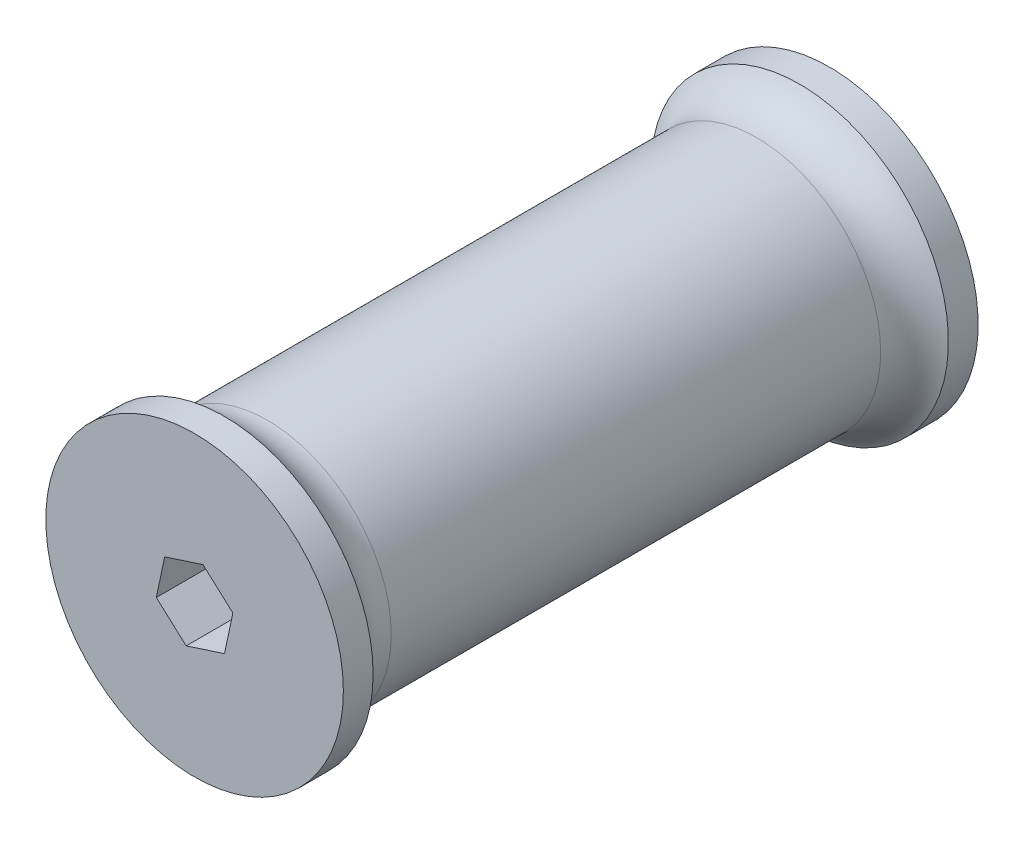
ISO-10303-21;
HEADER;
FILE_DESCRIPTION(('STEP AP214'),'2;1');
FILE_NAME('part.step','',(''),(''),'','','');
FILE_SCHEMA(('AUTOMOTIVE_DESIGN { 1 0 10303 214 1 1 1 1 }'));
ENDSEC;
DATA;
#1=APPLICATION_CONTEXT('core data for automotive mechanical design processes');
#2=APPLICATION_PROTOCOL_DEFINITION('international standard','automotive_design',2000,#1);
#3=PRODUCT_CONTEXT('',#1,'mechanical');
#4=PRODUCT('Part','Part','',(#3));
#5=PRODUCT_RELATED_PRODUCT_CATEGORY('part','',(#4));
#6=PRODUCT_DEFINITION_FORMATION('','',#4);
#7=PRODUCT_DEFINITION_CONTEXT('part definition',#1,'design');
#8=PRODUCT_DEFINITION('design','',#6,#7);
#9=PRODUCT_DEFINITION_SHAPE('','',#8);
#10=(LENGTH_UNIT() NAMED_UNIT(*) SI_UNIT(.MILLI.,.METRE.));
#11=(NAMED_UNIT(*) PLANE_ANGLE_UNIT() SI_UNIT($,.RADIAN.));
#12=(NAMED_UNIT(*) SI_UNIT($,.STERADIAN.) SOLID_ANGLE_UNIT());
#13=UNCERTAINTY_MEASURE_WITH_UNIT(LENGTH_MEASURE(1.E-05),#10,'distance_accuracy_value','');
#14=(GEOMETRIC_REPRESENTATION_CONTEXT(3) GLOBAL_UNCERTAINTY_ASSIGNED_CONTEXT((#13)) GLOBAL_UNIT_ASSIGNED_CONTEXT((#10,
#11,#12)) REPRESENTATION_CONTEXT('',''));
#15=CARTESIAN_POINT('',(0.,0.,0.));
#16=DIRECTION('',(0.,0.,1.));
#17=DIRECTION('',(1.,0.,0.));
#18=AXIS2_PLACEMENT_3D('',#15,#16,#17);
#19=CARTESIAN_POINT('',(0.,0.,-61.));
#20=DIRECTION('',(0.,0.,1.));
#21=DIRECTION('',(1.,0.,0.));
#22=AXIS2_PLACEMENT_3D('',#19,#20,#21);
#23=CYLINDRICAL_SURFACE('',#22,15.);
#24=CARTESIAN_POINT('',(0.,0.,-61.));
#25=DIRECTION('',(0.,0.,-1.));
#26=DIRECTION('',(-1.,0.,0.));
#27=AXIS2_PLACEMENT_3D('',#24,#25,#26);
#28=CIRCLE('',#27,15.);
#29=CARTESIAN_POINT('',(-15.,0.,-61.));
#30=VERTEX_POINT('',#29);
#31=EDGE_CURVE('E167',#30,#30,#28,.T.);
#32=ORIENTED_EDGE('',*,*,#31,.F.);
#33=EDGE_LOOP('',(#32));
#34=FACE_BOUND('',#33,.T.);
#35=CARTESIAN_POINT('',(0.,0.,-58.));
#36=DIRECTION('',(0.,0.,-1.));
#37=DIRECTION('',(-1.,0.,0.));
#38=AXIS2_PLACEMENT_3D('',#35,#36,#37);
#39=CIRCLE('',#38,15.);
#40=CARTESIAN_POINT('',(-15.,0.,-58.));
#41=VERTEX_POINT('',#40);
#42=EDGE_CURVE('E165',#41,#41,#39,.T.);
#43=ORIENTED_EDGE('',*,*,#42,.T.);
#44=EDGE_LOOP('',(#43));
#45=FACE_BOUND('',#44,.T.);
#46=ADVANCED_FACE('F33',(#34,#45),#23,.T.);
#47=CARTESIAN_POINT('',(0.,0.,-61.));
#48=DIRECTION('',(0.,0.,-1.));
#49=DIRECTION('',(-1.,0.,0.));
#50=AXIS2_PLACEMENT_3D('',#47,#48,#49);
#51=PLANE('',#50);
#52=CARTESIAN_POINT('',(0.,0.,-61.));
#53=DIRECTION('',(0.,0.,-1.));
#54=DIRECTION('',(-1.,0.,0.));
#55=AXIS2_PLACEMENT_3D('',#52,#53,#54);
#56=CIRCLE('',#55,2.05);
#57=CARTESIAN_POINT('',(0.160815888999146,2.043682521784,-61.));
#58=VERTEX_POINT('',#57);
#59=CARTESIAN_POINT('',(-2.04562172688168,0.133909486256969,-61.));
#60=VERTEX_POINT('',#59);
#61=EDGE_CURVE('E56',#58,#60,#56,.T.);
#62=ORIENTED_EDGE('',*,*,#61,.F.);
#63=DIRECTION('',(0.756108336125337,0.654446471486992,0.));
#64=VECTOR('',#63,1.);
#65=CARTESIAN_POINT('',(-2.04562172688168,0.133909486256968,-61.));
#66=LINE('',#65,#64);
#67=EDGE_CURVE('E156',#60,#58,#66,.T.);
#68=ORIENTED_EDGE('',*,*,#67,.F.);
#69=EDGE_LOOP('',(#62,#68));
#70=FACE_BOUND('',#69,.T.);
#71=ORIENTED_EDGE('',*,*,#31,.T.);
#72=EDGE_LOOP('',(#71));
#73=FACE_BOUND('',#72,.T.);
#74=ADVANCED_FACE('F195',(#70,#73),#51,.T.);
#75=CARTESIAN_POINT('',(0.,0.,-53.));
#76=DIRECTION('',(0.,0.,-1.));
#77=DIRECTION('',(-1.,0.,0.));
#78=AXIS2_PLACEMENT_3D('',#75,#76,#77);
#79=CYLINDRICAL_SURFACE('',#78,2.05);
#80=ORIENTED_EDGE('',*,*,#61,.T.);
#81=DIRECTION('',(0.,0.,-1.));
#82=VECTOR('',#81,1.);
#83=CARTESIAN_POINT('',(-2.04562172688168,0.133909486256968,-53.));
#84=LINE('',#83,#82);
#85=CARTESIAN_POINT('',(-2.04562172688168,0.133909486256968,-53.));
#86=VERTEX_POINT('',#85);
#87=EDGE_CURVE('E159',#86,#60,#84,.T.);
#88=ORIENTED_EDGE('',*,*,#87,.F.);
#89=CARTESIAN_POINT('',(0.,0.,-53.));
#90=DIRECTION('',(0.,0.,-1.));
#91=DIRECTION('',(-1.,0.,0.));
#92=AXIS2_PLACEMENT_3D('',#89,#90,#91);
#93=CIRCLE('',#92,2.05);
#94=CARTESIAN_POINT('',(0.160815888999146,2.043682521784,-53.));
#95=VERTEX_POINT('',#94);
#96=EDGE_CURVE('E152',#95,#86,#93,.T.);
#97=ORIENTED_EDGE('',*,*,#96,.F.);
#98=DIRECTION('',(0.,0.,-1.));
#99=VECTOR('',#98,1.);
#100=CARTESIAN_POINT('',(0.160815888999146,2.043682521784,-53.));
#101=LINE('',#100,#99);
#102=EDGE_CURVE('E163',#95,#58,#101,.T.);
#103=ORIENTED_EDGE('',*,*,#102,.T.);
#104=EDGE_LOOP('',(#80,#88,#97,#103));
#105=FACE_BOUND('',#104,.T.);
#106=ADVANCED_FACE('F201',(#105),#79,.F.);
#107=CARTESIAN_POINT('',(-2.04562172688168,0.133909486256968,-53.));
#108=DIRECTION('',(-0.654446471486992,0.756108336125337,0.));
#109=DIRECTION('',(-0.756108336125337,-0.654446471486992,0.));
#110=AXIS2_PLACEMENT_3D('',#107,#108,#109);
#111=PLANE('',#110);
#112=ORIENTED_EDGE('',*,*,#67,.T.);
#113=ORIENTED_EDGE('',*,*,#102,.F.);
#114=DIRECTION('',(0.756108336125337,0.654446471486992,0.));
#115=VECTOR('',#114,1.);
#116=CARTESIAN_POINT('',(-2.04562172688168,0.133909486256968,-53.));
#117=LINE('',#116,#115);
#118=EDGE_CURVE('E155',#86,#95,#117,.T.);
#119=ORIENTED_EDGE('',*,*,#118,.F.);
#120=ORIENTED_EDGE('',*,*,#87,.T.);
#121=EDGE_LOOP('',(#112,#113,#119,#120));
#122=FACE_BOUND('',#121,.T.);
#123=ADVANCED_FACE('F310',(#122),#111,.F.);
#124=CARTESIAN_POINT('',(0.,0.,-53.));
#125=DIRECTION('',(0.,0.,-1.));
#126=DIRECTION('',(-1.,0.,0.));
#127=AXIS2_PLACEMENT_3D('',#124,#125,#126);
#128=PLANE('',#127);
#129=ORIENTED_EDGE('',*,*,#96,.T.);
#130=ORIENTED_EDGE('',*,*,#118,.T.);
#131=EDGE_LOOP('',(#129,#130));
#132=FACE_BOUND('',#131,.T.);
#133=ADVANCED_FACE('F306',(#132),#128,.T.);
#134=CARTESIAN_POINT('',(0.,0.,-93.3553390593274));
#135=DIRECTION('',(0.,0.,1.));
#136=DIRECTION('',(1.,0.,0.));
#137=AXIS2_PLACEMENT_3D('',#134,#135,#136);
#138=CYLINDRICAL_SURFACE('',#137,12.5);
#139=CARTESIAN_POINT('',(0.,0.,-53.6698729810778));
#140=DIRECTION('',(0.,0.,-1.));
#141=DIRECTION('',(-1.,0.,0.));
#142=AXIS2_PLACEMENT_3D('',#139,#140,#141);
#143=CIRCLE('',#142,12.5);
#144=CARTESIAN_POINT('',(-12.5,0.,-53.6698729810778));
#145=VERTEX_POINT('',#144);
#146=EDGE_CURVE('E11',#145,#145,#143,.F.);
#147=ORIENTED_EDGE('',*,*,#146,.T.);
#148=EDGE_LOOP('',(#147));
#149=FACE_BOUND('',#148,.T.);
#150=CARTESIAN_POINT('',(0.,0.,-4.33012701892219));
#151=DIRECTION('',(0.,0.,1.));
#152=DIRECTION('',(1.,0.,0.));
#153=AXIS2_PLACEMENT_3D('',#150,#151,#152);
#154=CIRCLE('',#153,12.5);
#155=CARTESIAN_POINT('',(12.5,0.,-4.33012701892219));
#156=VERTEX_POINT('',#155);
#157=EDGE_CURVE('E41',#156,#156,#154,.F.);
#158=ORIENTED_EDGE('',*,*,#157,.T.);
#159=EDGE_LOOP('',(#158));
#160=FACE_BOUND('',#159,.T.);
#161=ADVANCED_FACE('F180',(#149,#160),#138,.T.);
#162=CARTESIAN_POINT('',(0.,0.,3.));
#163=DIRECTION('',(0.,0.,1.));
#164=DIRECTION('',(1.,0.,0.));
#165=AXIS2_PLACEMENT_3D('',#162,#163,#164);
#166=PLANE('',#165);
#167=DIRECTION('',(0.951315082902259,0.308220072420127,0.));
#168=VECTOR('',#167,1.);
#169=CARTESIAN_POINT('',(-0.847192142923414,-3.96937007676308,3.));
#170=LINE('',#169,#168);
#171=CARTESIAN_POINT('',(-0.847192142923414,-3.96937007676308,3.));
#172=VERTEX_POINT('',#171);
#173=CARTESIAN_POINT('',(3.01397925203691,-2.7183749560398,3.));
#174=VERTEX_POINT('',#173);
#175=EDGE_CURVE('E48',#172,#174,#170,.T.);
#176=ORIENTED_EDGE('',*,*,#175,.F.);
#177=DIRECTION('',(0.742583954123239,-0.669752992586592,0.));
#178=VECTOR('',#177,1.);
#179=CARTESIAN_POINT('',(-3.86117139496032,-1.25099512072329,3.));
#180=LINE('',#179,#178);
#181=CARTESIAN_POINT('',(-3.86117139496032,-1.25099512072329,3.));
#182=VERTEX_POINT('',#181);
#183=EDGE_CURVE('E119',#182,#172,#180,.T.);
#184=ORIENTED_EDGE('',*,*,#183,.F.);
#185=DIRECTION('',(-0.20873112877902,-0.977973065006719,0.));
#186=VECTOR('',#185,1.);
#187=CARTESIAN_POINT('',(-3.01397925203691,2.7183749560398,3.));
#188=LINE('',#187,#186);
#189=CARTESIAN_POINT('',(-3.01397925203691,2.7183749560398,3.));
#190=VERTEX_POINT('',#189);
#191=EDGE_CURVE('E122',#190,#182,#188,.T.);
#192=ORIENTED_EDGE('',*,*,#191,.F.);
#193=DIRECTION('',(-0.951315082902259,-0.308220072420127,0.));
#194=VECTOR('',#193,1.);
#195=CARTESIAN_POINT('',(0.847192142923415,3.96937007676308,3.));
#196=LINE('',#195,#194);
#197=CARTESIAN_POINT('',(0.847192142923415,3.96937007676308,3.));
#198=VERTEX_POINT('',#197);
#199=EDGE_CURVE('E138',#198,#190,#196,.T.);
#200=ORIENTED_EDGE('',*,*,#199,.F.);
#201=DIRECTION('',(-0.742583954123239,0.669752992586592,0.));
#202=VECTOR('',#201,1.);
#203=CARTESIAN_POINT('',(3.86117139496033,1.25099512072329,3.));
#204=LINE('',#203,#202);
#205=CARTESIAN_POINT('',(3.86117139496033,1.25099512072329,3.));
#206=VERTEX_POINT('',#205);
#207=EDGE_CURVE('E135',#206,#198,#204,.T.);
#208=ORIENTED_EDGE('',*,*,#207,.F.);
#209=DIRECTION('',(0.208731128779019,0.977973065006719,0.));
#210=VECTOR('',#209,1.);
#211=CARTESIAN_POINT('',(3.01397925203691,-2.7183749560398,3.));
#212=LINE('',#211,#210);
#213=EDGE_CURVE('E133',#174,#206,#212,.T.);
#214=ORIENTED_EDGE('',*,*,#213,.F.);
#215=EDGE_LOOP('',(#176,#184,#192,#200,#208,#214));
#216=FACE_BOUND('',#215,.T.);
#217=CARTESIAN_POINT('',(0.,0.,3.));
#218=DIRECTION('',(0.,0.,1.));
#219=DIRECTION('',(1.,0.,0.));
#220=AXIS2_PLACEMENT_3D('',#217,#218,#219);
#221=CIRCLE('',#220,15.);
#222=CARTESIAN_POINT('',(15.,0.,3.));
#223=VERTEX_POINT('',#222);
#224=EDGE_CURVE('E173',#223,#223,#221,.T.);
#225=ORIENTED_EDGE('',*,*,#224,.T.);
#226=EDGE_LOOP('',(#225));
#227=FACE_BOUND('',#226,.T.);
#228=ADVANCED_FACE('F208',(#216,#227),#166,.T.);
#229=CARTESIAN_POINT('',(0.,0.,3.));
#230=DIRECTION('',(0.,0.,-1.));
#231=DIRECTION('',(-1.,0.,0.));
#232=AXIS2_PLACEMENT_3D('',#229,#230,#231);
#233=CYLINDRICAL_SURFACE('',#232,15.);
#234=ORIENTED_EDGE('',*,*,#224,.F.);
#235=EDGE_LOOP('',(#234));
#236=FACE_BOUND('',#235,.T.);
#237=CARTESIAN_POINT('',(0.,0.,0.));
#238=DIRECTION('',(0.,0.,1.));
#239=DIRECTION('',(1.,0.,0.));
#240=AXIS2_PLACEMENT_3D('',#237,#238,#239);
#241=CIRCLE('',#240,15.);
#242=CARTESIAN_POINT('',(15.,0.,0.));
#243=VERTEX_POINT('',#242);
#244=EDGE_CURVE('E170',#243,#243,#241,.T.);
#245=ORIENTED_EDGE('',*,*,#244,.T.);
#246=EDGE_LOOP('',(#245));
#247=FACE_BOUND('',#246,.T.);
#248=ADVANCED_FACE('F191',(#236,#247),#233,.T.);
#249=CARTESIAN_POINT('',(0.,0.,-53.6698729810778));
#250=DIRECTION('',(0.,0.,-1.));
#251=DIRECTION('',(-1.,0.,0.));
#252=AXIS2_PLACEMENT_3D('',#249,#250,#251);
#253=TOROIDAL_SURFACE('',#252,17.5,5.);
#254=ORIENTED_EDGE('',*,*,#42,.F.);
#255=EDGE_LOOP('',(#254));
#256=FACE_BOUND('',#255,.T.);
#257=ORIENTED_EDGE('',*,*,#146,.F.);
#258=EDGE_LOOP('',(#257));
#259=FACE_BOUND('',#258,.T.);
#260=ADVANCED_FACE('F183',(#256,#259),#253,.F.);
#261=CARTESIAN_POINT('',(0.,0.,-4.33012701892219));
#262=DIRECTION('',(0.,0.,1.));
#263=DIRECTION('',(1.,0.,0.));
#264=AXIS2_PLACEMENT_3D('',#261,#262,#263);
#265=TOROIDAL_SURFACE('',#264,17.5,5.);
#266=ORIENTED_EDGE('',*,*,#244,.F.);
#267=EDGE_LOOP('',(#266));
#268=FACE_BOUND('',#267,.T.);
#269=ORIENTED_EDGE('',*,*,#157,.F.);
#270=EDGE_LOOP('',(#269));
#271=FACE_BOUND('',#270,.T.);
#272=ADVANCED_FACE('F35',(#268,#271),#265,.F.);
#273=CARTESIAN_POINT('',(-0.847192142923414,-3.96937007676308,-37.));
#274=DIRECTION('',(0.308220072420127,-0.951315082902259,0.));
#275=DIRECTION('',(0.951315082902259,0.308220072420127,0.));
#276=AXIS2_PLACEMENT_3D('',#273,#274,#275);
#277=PLANE('',#276);
#278=ORIENTED_EDGE('',*,*,#175,.T.);
#279=DIRECTION('',(0.,0.,1.));
#280=VECTOR('',#279,1.);
#281=CARTESIAN_POINT('',(3.01397925203691,-2.7183749560398,-37.));
#282=LINE('',#281,#280);
#283=CARTESIAN_POINT('',(3.01397925203691,-2.7183749560398,-37.));
#284=VERTEX_POINT('',#283);
#285=EDGE_CURVE('E96',#284,#174,#282,.T.);
#286=ORIENTED_EDGE('',*,*,#285,.F.);
#287=DIRECTION('',(0.951315082902259,0.308220072420127,0.));
#288=VECTOR('',#287,1.);
#289=CARTESIAN_POINT('',(-0.847192142923414,-3.96937007676308,-37.));
#290=LINE('',#289,#288);
#291=CARTESIAN_POINT('',(-0.847192142923414,-3.96937007676308,-37.));
#292=VERTEX_POINT('',#291);
#293=EDGE_CURVE('E100',#292,#284,#290,.T.);
#294=ORIENTED_EDGE('',*,*,#293,.F.);
#295=DIRECTION('',(0.,0.,1.));
#296=VECTOR('',#295,1.);
#297=CARTESIAN_POINT('',(-0.847192142923414,-3.96937007676308,-37.));
#298=LINE('',#297,#296);
#299=EDGE_CURVE('E143',#292,#172,#298,.T.);
#300=ORIENTED_EDGE('',*,*,#299,.T.);
#301=EDGE_LOOP('',(#278,#286,#294,#300));
#302=FACE_BOUND('',#301,.T.);
#303=ADVANCED_FACE('F98',(#302),#277,.F.);
#304=CARTESIAN_POINT('',(-3.86117139496032,-1.25099512072329,-37.));
#305=DIRECTION('',(-0.669752992586592,-0.742583954123239,0.));
#306=DIRECTION('',(0.742583954123239,-0.669752992586592,0.));
#307=AXIS2_PLACEMENT_3D('',#304,#305,#306);
#308=PLANE('',#307);
#309=ORIENTED_EDGE('',*,*,#183,.T.);
#310=ORIENTED_EDGE('',*,*,#299,.F.);
#311=DIRECTION('',(0.742583954123239,-0.669752992586592,0.));
#312=VECTOR('',#311,1.);
#313=CARTESIAN_POINT('',(-3.86117139496032,-1.25099512072329,-37.));
#314=LINE('',#313,#312);
#315=CARTESIAN_POINT('',(-3.86117139496032,-1.25099512072329,-37.));
#316=VERTEX_POINT('',#315);
#317=EDGE_CURVE('E106',#316,#292,#314,.T.);
#318=ORIENTED_EDGE('',*,*,#317,.F.);
#319=DIRECTION('',(0.,0.,1.));
#320=VECTOR('',#319,1.);
#321=CARTESIAN_POINT('',(-3.86117139496032,-1.25099512072329,-37.));
#322=LINE('',#321,#320);
#323=EDGE_CURVE('E145',#316,#182,#322,.T.);
#324=ORIENTED_EDGE('',*,*,#323,.T.);
#325=EDGE_LOOP('',(#309,#310,#318,#324));
#326=FACE_BOUND('',#325,.T.);
#327=ADVANCED_FACE('F189',(#326),#308,.F.);
#328=CARTESIAN_POINT('',(-3.01397925203691,2.7183749560398,-37.));
#329=DIRECTION('',(-0.977973065006719,0.20873112877902,0.));
#330=DIRECTION('',(-0.20873112877902,-0.977973065006719,0.));
#331=AXIS2_PLACEMENT_3D('',#328,#329,#330);
#332=PLANE('',#331);
#333=ORIENTED_EDGE('',*,*,#191,.T.);
#334=ORIENTED_EDGE('',*,*,#323,.F.);
#335=DIRECTION('',(-0.20873112877902,-0.977973065006719,0.));
#336=VECTOR('',#335,1.);
#337=CARTESIAN_POINT('',(-3.01397925203691,2.7183749560398,-37.));
#338=LINE('',#337,#336);
#339=CARTESIAN_POINT('',(-3.01397925203691,2.7183749560398,-37.));
#340=VERTEX_POINT('',#339);
#341=EDGE_CURVE('E129',#340,#316,#338,.T.);
#342=ORIENTED_EDGE('',*,*,#341,.F.);
#343=DIRECTION('',(0.,0.,1.));
#344=VECTOR('',#343,1.);
#345=CARTESIAN_POINT('',(-3.01397925203691,2.7183749560398,-37.));
#346=LINE('',#345,#344);
#347=EDGE_CURVE('E147',#340,#190,#346,.T.);
#348=ORIENTED_EDGE('',*,*,#347,.T.);
#349=EDGE_LOOP('',(#333,#334,#342,#348));
#350=FACE_BOUND('',#349,.T.);
#351=ADVANCED_FACE('F254',(#350),#332,.F.);
#352=CARTESIAN_POINT('',(0.847192142923415,3.96937007676308,-37.));
#353=DIRECTION('',(-0.308220072420127,0.951315082902259,0.));
#354=DIRECTION('',(-0.951315082902259,-0.308220072420127,0.));
#355=AXIS2_PLACEMENT_3D('',#352,#353,#354);
#356=PLANE('',#355);
#357=ORIENTED_EDGE('',*,*,#199,.T.);
#358=ORIENTED_EDGE('',*,*,#347,.F.);
#359=DIRECTION('',(-0.951315082902259,-0.308220072420127,0.));
#360=VECTOR('',#359,1.);
#361=CARTESIAN_POINT('',(0.847192142923415,3.96937007676308,-37.));
#362=LINE('',#361,#360);
#363=CARTESIAN_POINT('',(0.847192142923415,3.96937007676308,-37.));
#364=VERTEX_POINT('',#363);
#365=EDGE_CURVE('E126',#364,#340,#362,.T.);
#366=ORIENTED_EDGE('',*,*,#365,.F.);
#367=DIRECTION('',(0.,0.,1.));
#368=VECTOR('',#367,1.);
#369=CARTESIAN_POINT('',(0.847192142923415,3.96937007676308,-37.));
#370=LINE('',#369,#368);
#371=EDGE_CURVE('E149',#364,#198,#370,.T.);
#372=ORIENTED_EDGE('',*,*,#371,.T.);
#373=EDGE_LOOP('',(#357,#358,#366,#372));
#374=FACE_BOUND('',#373,.T.);
#375=ADVANCED_FACE('F264',(#374),#356,.F.);
#376=CARTESIAN_POINT('',(3.86117139496033,1.25099512072329,-37.));
#377=DIRECTION('',(0.669752992586592,0.742583954123239,0.));
#378=DIRECTION('',(-0.742583954123239,0.669752992586592,0.));
#379=AXIS2_PLACEMENT_3D('',#376,#377,#378);
#380=PLANE('',#379);
#381=ORIENTED_EDGE('',*,*,#207,.T.);
#382=ORIENTED_EDGE('',*,*,#371,.F.);
#383=DIRECTION('',(-0.742583954123239,0.669752992586592,0.));
#384=VECTOR('',#383,1.);
#385=CARTESIAN_POINT('',(3.86117139496033,1.25099512072329,-37.));
#386=LINE('',#385,#384);
#387=CARTESIAN_POINT('',(3.86117139496033,1.25099512072329,-37.));
#388=VERTEX_POINT('',#387);
#389=EDGE_CURVE('E114',#388,#364,#386,.T.);
#390=ORIENTED_EDGE('',*,*,#389,.F.);
#391=DIRECTION('',(0.,0.,1.));
#392=VECTOR('',#391,1.);
#393=CARTESIAN_POINT('',(3.86117139496033,1.25099512072329,-37.));
#394=LINE('',#393,#392);
#395=EDGE_CURVE('E105',#388,#206,#394,.T.);
#396=ORIENTED_EDGE('',*,*,#395,.T.);
#397=EDGE_LOOP('',(#381,#382,#390,#396));
#398=FACE_BOUND('',#397,.T.);
#399=ADVANCED_FACE('F274',(#398),#380,.F.);
#400=CARTESIAN_POINT('',(3.01397925203691,-2.7183749560398,-37.));
#401=DIRECTION('',(0.977973065006719,-0.208731128779019,0.));
#402=DIRECTION('',(0.208731128779019,0.977973065006719,0.));
#403=AXIS2_PLACEMENT_3D('',#400,#401,#402);
#404=PLANE('',#403);
#405=ORIENTED_EDGE('',*,*,#213,.T.);
#406=ORIENTED_EDGE('',*,*,#395,.F.);
#407=DIRECTION('',(0.208731128779019,0.977973065006719,0.));
#408=VECTOR('',#407,1.);
#409=CARTESIAN_POINT('',(3.01397925203691,-2.7183749560398,-37.));
#410=LINE('',#409,#408);
#411=EDGE_CURVE('E109',#284,#388,#410,.T.);
#412=ORIENTED_EDGE('',*,*,#411,.F.);
#413=ORIENTED_EDGE('',*,*,#285,.T.);
#414=EDGE_LOOP('',(#405,#406,#412,#413));
#415=FACE_BOUND('',#414,.T.);
#416=ADVANCED_FACE('F110',(#415),#404,.F.);
#417=CARTESIAN_POINT('',(0.,0.,-37.));
#418=DIRECTION('',(0.,0.,1.));
#419=DIRECTION('',(1.,0.,0.));
#420=AXIS2_PLACEMENT_3D('',#417,#418,#419);
#421=PLANE('',#420);
#422=ORIENTED_EDGE('',*,*,#293,.T.);
#423=ORIENTED_EDGE('',*,*,#411,.T.);
#424=ORIENTED_EDGE('',*,*,#389,.T.);
#425=ORIENTED_EDGE('',*,*,#365,.T.);
#426=ORIENTED_EDGE('',*,*,#341,.T.);
#427=ORIENTED_EDGE('',*,*,#317,.T.);
#428=EDGE_LOOP('',(#422,#423,#424,#425,#426,#427));
#429=FACE_BOUND('',#428,.T.);
#430=ADVANCED_FACE('F116',(#429),#421,.T.);
#431=CLOSED_SHELL('',(#46,#74,#106,#123,#133,#161,#228,#248,#260,#272,#303,#327,#351,#375,#399,
#416,#430));
#432=MANIFOLD_SOLID_BREP('B2',#431);
#433=ADVANCED_BREP_SHAPE_REPRESENTATION('',(#18,#432),#14);
#434=SHAPE_DEFINITION_REPRESENTATION(#9,#433);
ENDSEC;
END-ISO-10303-21;
